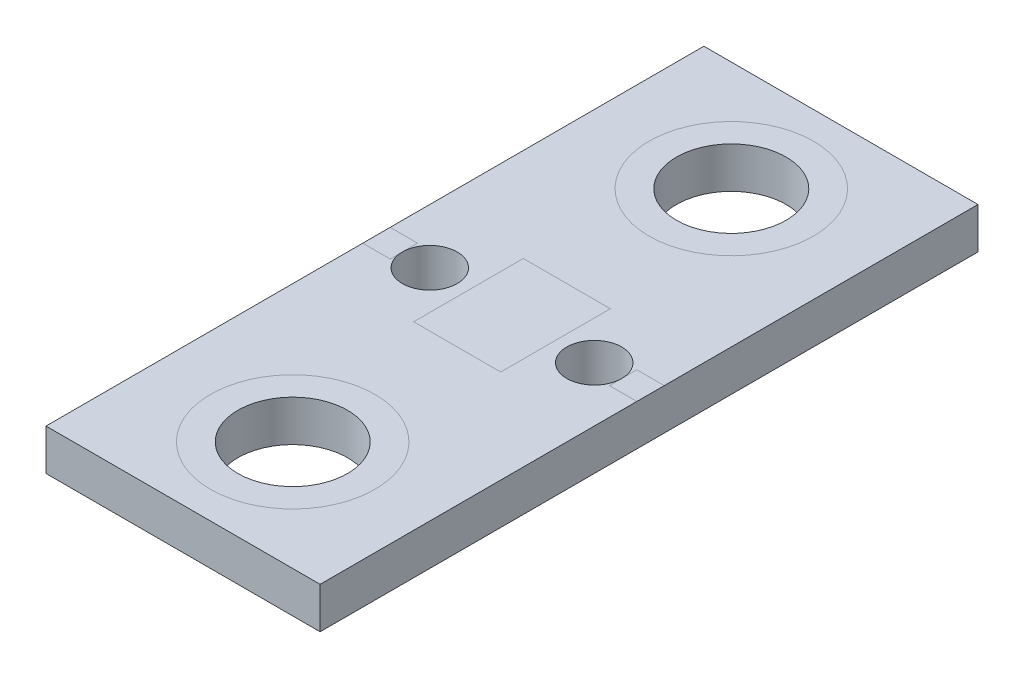
ISO-10303-21;
HEADER;
FILE_DESCRIPTION(('STEP AP214'),'2;1');
FILE_NAME('part.step','',(''),(''),'','','');
FILE_SCHEMA(('AUTOMOTIVE_DESIGN { 1 0 10303 214 1 1 1 1 }'));
ENDSEC;
DATA;
#1=APPLICATION_CONTEXT('core data for automotive mechanical design processes');
#2=APPLICATION_PROTOCOL_DEFINITION('international standard','automotive_design',2000,#1);
#3=PRODUCT_CONTEXT('',#1,'mechanical');
#4=PRODUCT('Part','Part','',(#3));
#5=PRODUCT_RELATED_PRODUCT_CATEGORY('part','',(#4));
#6=PRODUCT_DEFINITION_FORMATION('','',#4);
#7=PRODUCT_DEFINITION_CONTEXT('part definition',#1,'design');
#8=PRODUCT_DEFINITION('design','',#6,#7);
#9=PRODUCT_DEFINITION_SHAPE('','',#8);
#10=(LENGTH_UNIT() NAMED_UNIT(*) SI_UNIT(.MILLI.,.METRE.));
#11=(NAMED_UNIT(*) PLANE_ANGLE_UNIT() SI_UNIT($,.RADIAN.));
#12=(NAMED_UNIT(*) SI_UNIT($,.STERADIAN.) SOLID_ANGLE_UNIT());
#13=UNCERTAINTY_MEASURE_WITH_UNIT(LENGTH_MEASURE(1.E-05),#10,'distance_accuracy_value','');
#14=(GEOMETRIC_REPRESENTATION_CONTEXT(3) GLOBAL_UNCERTAINTY_ASSIGNED_CONTEXT((#13)) GLOBAL_UNIT_ASSIGNED_CONTEXT((#10,
#11,#12)) REPRESENTATION_CONTEXT('',''));
#15=CARTESIAN_POINT('',(0.,0.,0.));
#16=DIRECTION('',(0.,0.,1.));
#17=DIRECTION('',(1.,0.,0.));
#18=AXIS2_PLACEMENT_3D('',#15,#16,#17);
#19=CARTESIAN_POINT('',(0.,0.75,0.));
#20=DIRECTION('',(0.,1.,0.));
#21=DIRECTION('',(0.,0.,1.));
#22=AXIS2_PLACEMENT_3D('',#19,#20,#21);
#23=PLANE('',#22);
#24=CARTESIAN_POINT('',(0.,0.75,4.));
#25=DIRECTION('',(0.,1.,0.));
#26=DIRECTION('',(0.,0.,1.));
#27=AXIS2_PLACEMENT_3D('',#24,#25,#26);
#28=CIRCLE('',#27,1.5);
#29=CARTESIAN_POINT('',(0.,0.75,5.5));
#30=VERTEX_POINT('',#29);
#31=EDGE_CURVE('E50',#30,#30,#28,.F.);
#32=ORIENTED_EDGE('',*,*,#31,.T.);
#33=EDGE_LOOP('',(#32));
#34=FACE_BOUND('',#33,.T.);
#35=DIRECTION('',(0.,0.,-1.));
#36=VECTOR('',#35,1.);
#37=CARTESIAN_POINT('',(2.,0.75,0.));
#38=LINE('',#37,#36);
#39=CARTESIAN_POINT('',(2.,0.75,0.));
#40=VERTEX_POINT('',#39);
#41=CARTESIAN_POINT('',(2.,0.75,-0.277507708159874));
#42=VERTEX_POINT('',#41);
#43=EDGE_CURVE('E174',#40,#42,#38,.T.);
#44=ORIENTED_EDGE('',*,*,#43,.T.);
#45=DIRECTION('',(1.,0.,0.));
#46=VECTOR('',#45,1.);
#47=CARTESIAN_POINT('',(0.,0.75,-0.277507708159874));
#48=LINE('',#47,#46);
#49=CARTESIAN_POINT('',(2.5,0.75,-0.277507708159874));
#50=VERTEX_POINT('',#49);
#51=EDGE_CURVE('E129',#42,#50,#48,.T.);
#52=ORIENTED_EDGE('',*,*,#51,.T.);
#53=DIRECTION('',(0.,0.,-1.));
#54=VECTOR('',#53,1.);
#55=CARTESIAN_POINT('',(2.5,0.75,-6.));
#56=LINE('',#55,#54);
#57=CARTESIAN_POINT('',(2.5,0.75,-6.));
#58=VERTEX_POINT('',#57);
#59=EDGE_CURVE('E122',#50,#58,#56,.T.);
#60=ORIENTED_EDGE('',*,*,#59,.T.);
#61=DIRECTION('',(-1.,0.,0.));
#62=VECTOR('',#61,1.);
#63=CARTESIAN_POINT('',(-2.5,0.75,-6.));
#64=LINE('',#63,#62);
#65=CARTESIAN_POINT('',(-2.5,0.75,-6.));
#66=VERTEX_POINT('',#65);
#67=EDGE_CURVE('E127',#58,#66,#64,.T.);
#68=ORIENTED_EDGE('',*,*,#67,.T.);
#69=DIRECTION('',(0.,0.,1.));
#70=VECTOR('',#69,1.);
#71=CARTESIAN_POINT('',(-2.5,0.75,-6.));
#72=LINE('',#71,#70);
#73=CARTESIAN_POINT('',(-2.5,0.75,-0.277507708159873));
#74=VERTEX_POINT('',#73);
#75=EDGE_CURVE('E226',#66,#74,#72,.T.);
#76=ORIENTED_EDGE('',*,*,#75,.T.);
#77=DIRECTION('',(1.,0.,0.));
#78=VECTOR('',#77,1.);
#79=CARTESIAN_POINT('',(0.,0.75,-0.277507708159874));
#80=LINE('',#79,#78);
#81=CARTESIAN_POINT('',(-2.,0.75,-0.277507708159874));
#82=VERTEX_POINT('',#81);
#83=EDGE_CURVE('E163',#74,#82,#80,.T.);
#84=ORIENTED_EDGE('',*,*,#83,.T.);
#85=DIRECTION('',(0.,0.,1.));
#86=VECTOR('',#85,1.);
#87=CARTESIAN_POINT('',(-2.,0.75,0.));
#88=LINE('',#87,#86);
#89=CARTESIAN_POINT('',(-2.,0.75,0.));
#90=VERTEX_POINT('',#89);
#91=EDGE_CURVE('E162',#82,#90,#88,.T.);
#92=ORIENTED_EDGE('',*,*,#91,.T.);
#93=CARTESIAN_POINT('',(-1.5,0.75,0.));
#94=DIRECTION('',(0.,1.,0.));
#95=DIRECTION('',(0.,0.,1.));
#96=AXIS2_PLACEMENT_3D('',#93,#94,#95);
#97=CIRCLE('',#96,0.5);
#98=EDGE_CURVE('E220',#90,#90,#97,.T.);
#99=ORIENTED_EDGE('',*,*,#98,.F.);
#100=CARTESIAN_POINT('',(-2.,0.75,0.222492291840126));
#101=VERTEX_POINT('',#100);
#102=EDGE_CURVE('E154',#90,#101,#88,.T.);
#103=ORIENTED_EDGE('',*,*,#102,.T.);
#104=DIRECTION('',(-1.,0.,0.));
#105=VECTOR('',#104,1.);
#106=CARTESIAN_POINT('',(0.,0.75,0.222492291840126));
#107=LINE('',#106,#105);
#108=CARTESIAN_POINT('',(-2.5,0.75,0.222492291840126));
#109=VERTEX_POINT('',#108);
#110=EDGE_CURVE('E151',#101,#109,#107,.T.);
#111=ORIENTED_EDGE('',*,*,#110,.T.);
#112=CARTESIAN_POINT('',(-2.5,0.75,6.));
#113=VERTEX_POINT('',#112);
#114=EDGE_CURVE('E146',#109,#113,#72,.T.);
#115=ORIENTED_EDGE('',*,*,#114,.T.);
#116=DIRECTION('',(1.,0.,0.));
#117=VECTOR('',#116,1.);
#118=CARTESIAN_POINT('',(-2.5,0.75,6.));
#119=LINE('',#118,#117);
#120=CARTESIAN_POINT('',(2.5,0.75,6.));
#121=VERTEX_POINT('',#120);
#122=EDGE_CURVE('E228',#113,#121,#119,.T.);
#123=ORIENTED_EDGE('',*,*,#122,.T.);
#124=CARTESIAN_POINT('',(2.5,0.75,0.222492291840126));
#125=VERTEX_POINT('',#124);
#126=EDGE_CURVE('E137',#121,#125,#56,.T.);
#127=ORIENTED_EDGE('',*,*,#126,.T.);
#128=DIRECTION('',(-1.,0.,0.));
#129=VECTOR('',#128,1.);
#130=CARTESIAN_POINT('',(0.,0.75,0.222492291840126));
#131=LINE('',#130,#129);
#132=CARTESIAN_POINT('',(2.,0.75,0.222492291840126));
#133=VERTEX_POINT('',#132);
#134=EDGE_CURVE('E166',#125,#133,#131,.T.);
#135=ORIENTED_EDGE('',*,*,#134,.T.);
#136=EDGE_CURVE('E170',#133,#40,#38,.T.);
#137=ORIENTED_EDGE('',*,*,#136,.T.);
#138=CARTESIAN_POINT('',(1.5,0.75,0.));
#139=DIRECTION('',(0.,1.,0.));
#140=DIRECTION('',(0.,0.,1.));
#141=AXIS2_PLACEMENT_3D('',#138,#139,#140);
#142=CIRCLE('',#141,0.5);
#143=EDGE_CURVE('E208',#40,#40,#142,.T.);
#144=ORIENTED_EDGE('',*,*,#143,.F.);
#145=EDGE_LOOP('',(#44,#52,#60,#68,#76,#84,#92,#99,#103,#111,#115,#123,#127,#135,#137,#144));
#146=FACE_BOUND('',#145,.T.);
#147=DIRECTION('',(1.,0.,0.));
#148=VECTOR('',#147,1.);
#149=CARTESIAN_POINT('',(0.,0.75,-1.));
#150=LINE('',#149,#148);
#151=CARTESIAN_POINT('',(-0.79375,0.75,-1.));
#152=VERTEX_POINT('',#151);
#153=CARTESIAN_POINT('',(0.79375,0.75,-1.));
#154=VERTEX_POINT('',#153);
#155=EDGE_CURVE('E61',#152,#154,#150,.T.);
#156=ORIENTED_EDGE('',*,*,#155,.T.);
#157=DIRECTION('',(0.,0.,1.));
#158=VECTOR('',#157,1.);
#159=CARTESIAN_POINT('',(0.79375,0.75,0.));
#160=LINE('',#159,#158);
#161=CARTESIAN_POINT('',(0.79375,0.75,1.));
#162=VERTEX_POINT('',#161);
#163=EDGE_CURVE('E57',#154,#162,#160,.T.);
#164=ORIENTED_EDGE('',*,*,#163,.T.);
#165=DIRECTION('',(-1.,0.,0.));
#166=VECTOR('',#165,1.);
#167=CARTESIAN_POINT('',(0.,0.75,1.));
#168=LINE('',#167,#166);
#169=CARTESIAN_POINT('',(-0.79375,0.75,1.));
#170=VERTEX_POINT('',#169);
#171=EDGE_CURVE('E177',#162,#170,#168,.T.);
#172=ORIENTED_EDGE('',*,*,#171,.T.);
#173=DIRECTION('',(0.,0.,-1.));
#174=VECTOR('',#173,1.);
#175=CARTESIAN_POINT('',(-0.79375,0.75,0.));
#176=LINE('',#175,#174);
#177=EDGE_CURVE('E181',#170,#152,#176,.T.);
#178=ORIENTED_EDGE('',*,*,#177,.T.);
#179=EDGE_LOOP('',(#156,#164,#172,#178));
#180=FACE_BOUND('',#179,.T.);
#181=CARTESIAN_POINT('',(0.,0.75,-4.));
#182=DIRECTION('',(0.,1.,0.));
#183=DIRECTION('',(0.,0.,1.));
#184=AXIS2_PLACEMENT_3D('',#181,#182,#183);
#185=CIRCLE('',#184,1.5);
#186=CARTESIAN_POINT('',(0.,0.75,-2.5));
#187=VERTEX_POINT('',#186);
#188=EDGE_CURVE('E11',#187,#187,#185,.F.);
#189=ORIENTED_EDGE('',*,*,#188,.T.);
#190=EDGE_LOOP('',(#189));
#191=FACE_BOUND('',#190,.T.);
#192=ADVANCED_FACE('F41',(#34,#146,#180,#191),#23,.T.);
#193=ORIENTED_EDGE('',*,*,#188,.F.);
#194=EDGE_LOOP('',(#193));
#195=FACE_BOUND('',#194,.T.);
#196=CARTESIAN_POINT('',(0.,0.75,-4.));
#197=DIRECTION('',(0.,1.,0.));
#198=DIRECTION('',(0.,0.,1.));
#199=AXIS2_PLACEMENT_3D('',#196,#197,#198);
#200=CIRCLE('',#199,1.);
#201=CARTESIAN_POINT('',(0.,0.75,-3.));
#202=VERTEX_POINT('',#201);
#203=EDGE_CURVE('E211',#202,#202,#200,.T.);
#204=ORIENTED_EDGE('',*,*,#203,.F.);
#205=EDGE_LOOP('',(#204));
#206=FACE_BOUND('',#205,.T.);
#207=ADVANCED_FACE('F198',(#195,#206),#23,.T.);
#208=ORIENTED_EDGE('',*,*,#31,.F.);
#209=EDGE_LOOP('',(#208));
#210=FACE_BOUND('',#209,.T.);
#211=CARTESIAN_POINT('',(0.,0.75,4.));
#212=DIRECTION('',(0.,1.,0.));
#213=DIRECTION('',(0.,0.,1.));
#214=AXIS2_PLACEMENT_3D('',#211,#212,#213);
#215=CIRCLE('',#214,1.);
#216=CARTESIAN_POINT('',(0.,0.75,5.));
#217=VERTEX_POINT('',#216);
#218=EDGE_CURVE('E202',#217,#217,#215,.T.);
#219=ORIENTED_EDGE('',*,*,#218,.F.);
#220=EDGE_LOOP('',(#219));
#221=FACE_BOUND('',#220,.T.);
#222=ADVANCED_FACE('F194',(#210,#221),#23,.T.);
#223=ORIENTED_EDGE('',*,*,#163,.F.);
#224=ORIENTED_EDGE('',*,*,#155,.F.);
#225=ORIENTED_EDGE('',*,*,#177,.F.);
#226=ORIENTED_EDGE('',*,*,#171,.F.);
#227=EDGE_LOOP('',(#223,#224,#225,#226));
#228=FACE_BOUND('',#227,.T.);
#229=ADVANCED_FACE('F197',(#228),#23,.T.);
#230=ORIENTED_EDGE('',*,*,#51,.F.);
#231=ORIENTED_EDGE('',*,*,#43,.F.);
#232=ORIENTED_EDGE('',*,*,#136,.F.);
#233=ORIENTED_EDGE('',*,*,#134,.F.);
#234=EDGE_CURVE('E134',#125,#50,#56,.T.);
#235=ORIENTED_EDGE('',*,*,#234,.T.);
#236=EDGE_LOOP('',(#230,#231,#232,#233,#235));
#237=FACE_BOUND('',#236,.T.);
#238=ADVANCED_FACE('F290',(#237),#23,.T.);
#239=ORIENTED_EDGE('',*,*,#83,.F.);
#240=EDGE_CURVE('E229',#74,#109,#72,.T.);
#241=ORIENTED_EDGE('',*,*,#240,.T.);
#242=ORIENTED_EDGE('',*,*,#110,.F.);
#243=ORIENTED_EDGE('',*,*,#102,.F.);
#244=ORIENTED_EDGE('',*,*,#91,.F.);
#245=EDGE_LOOP('',(#239,#241,#242,#243,#244));
#246=FACE_BOUND('',#245,.T.);
#247=ADVANCED_FACE('F258',(#246),#23,.T.);
#248=CARTESIAN_POINT('',(0.,0.,0.));
#249=DIRECTION('',(0.,1.,0.));
#250=DIRECTION('',(0.,0.,1.));
#251=AXIS2_PLACEMENT_3D('',#248,#249,#250);
#252=PLANE('',#251);
#253=DIRECTION('',(0.,0.,-1.));
#254=VECTOR('',#253,1.);
#255=CARTESIAN_POINT('',(2.5,0.,-6.));
#256=LINE('',#255,#254);
#257=CARTESIAN_POINT('',(2.5,0.,6.));
#258=VERTEX_POINT('',#257);
#259=CARTESIAN_POINT('',(2.5,0.,-6.));
#260=VERTEX_POINT('',#259);
#261=EDGE_CURVE('E150',#258,#260,#256,.T.);
#262=ORIENTED_EDGE('',*,*,#261,.F.);
#263=DIRECTION('',(1.,0.,0.));
#264=VECTOR('',#263,1.);
#265=CARTESIAN_POINT('',(-2.5,0.,6.));
#266=LINE('',#265,#264);
#267=CARTESIAN_POINT('',(-2.5,0.,6.));
#268=VERTEX_POINT('',#267);
#269=EDGE_CURVE('E135',#268,#258,#266,.T.);
#270=ORIENTED_EDGE('',*,*,#269,.F.);
#271=DIRECTION('',(0.,0.,1.));
#272=VECTOR('',#271,1.);
#273=CARTESIAN_POINT('',(-2.5,0.,-6.));
#274=LINE('',#273,#272);
#275=CARTESIAN_POINT('',(-2.5,0.,-6.));
#276=VERTEX_POINT('',#275);
#277=EDGE_CURVE('E235',#276,#268,#274,.T.);
#278=ORIENTED_EDGE('',*,*,#277,.F.);
#279=DIRECTION('',(-1.,0.,0.));
#280=VECTOR('',#279,1.);
#281=CARTESIAN_POINT('',(-2.5,0.,-6.));
#282=LINE('',#281,#280);
#283=EDGE_CURVE('E233',#260,#276,#282,.T.);
#284=ORIENTED_EDGE('',*,*,#283,.F.);
#285=EDGE_LOOP('',(#262,#270,#278,#284));
#286=FACE_BOUND('',#285,.T.);
#287=CARTESIAN_POINT('',(-1.5,0.,0.));
#288=DIRECTION('',(0.,1.,0.));
#289=DIRECTION('',(0.,0.,1.));
#290=AXIS2_PLACEMENT_3D('',#287,#288,#289);
#291=CIRCLE('',#290,0.5);
#292=CARTESIAN_POINT('',(-1.5,0.,0.500000000000001));
#293=VERTEX_POINT('',#292);
#294=EDGE_CURVE('E218',#293,#293,#291,.T.);
#295=ORIENTED_EDGE('',*,*,#294,.T.);
#296=EDGE_LOOP('',(#295));
#297=FACE_BOUND('',#296,.T.);
#298=CARTESIAN_POINT('',(1.5,0.,0.));
#299=DIRECTION('',(0.,1.,0.));
#300=DIRECTION('',(0.,0.,1.));
#301=AXIS2_PLACEMENT_3D('',#298,#299,#300);
#302=CIRCLE('',#301,0.5);
#303=CARTESIAN_POINT('',(1.5,0.,0.5));
#304=VERTEX_POINT('',#303);
#305=EDGE_CURVE('E204',#304,#304,#302,.T.);
#306=ORIENTED_EDGE('',*,*,#305,.T.);
#307=EDGE_LOOP('',(#306));
#308=FACE_BOUND('',#307,.T.);
#309=CARTESIAN_POINT('',(0.,0.,4.));
#310=DIRECTION('',(0.,1.,0.));
#311=DIRECTION('',(0.,0.,1.));
#312=AXIS2_PLACEMENT_3D('',#309,#310,#311);
#313=CIRCLE('',#312,1.);
#314=CARTESIAN_POINT('',(0.,0.,5.));
#315=VERTEX_POINT('',#314);
#316=EDGE_CURVE('E205',#315,#315,#313,.T.);
#317=ORIENTED_EDGE('',*,*,#316,.T.);
#318=EDGE_LOOP('',(#317));
#319=FACE_BOUND('',#318,.T.);
#320=CARTESIAN_POINT('',(0.,0.,-4.));
#321=DIRECTION('',(0.,1.,0.));
#322=DIRECTION('',(0.,0.,1.));
#323=AXIS2_PLACEMENT_3D('',#320,#321,#322);
#324=CIRCLE('',#323,1.);
#325=CARTESIAN_POINT('',(0.,0.,-3.));
#326=VERTEX_POINT('',#325);
#327=EDGE_CURVE('E214',#326,#326,#324,.T.);
#328=ORIENTED_EDGE('',*,*,#327,.T.);
#329=EDGE_LOOP('',(#328));
#330=FACE_BOUND('',#329,.T.);
#331=ADVANCED_FACE('F249',(#286,#297,#308,#319,#330),#252,.F.);
#332=CARTESIAN_POINT('',(2.5,0.75,-6.));
#333=DIRECTION('',(-1.,0.,0.));
#334=DIRECTION('',(0.,0.,1.));
#335=AXIS2_PLACEMENT_3D('',#332,#333,#334);
#336=PLANE('',#335);
#337=ORIENTED_EDGE('',*,*,#261,.T.);
#338=DIRECTION('',(0.,-1.,0.));
#339=VECTOR('',#338,1.);
#340=CARTESIAN_POINT('',(2.5,0.75,-6.));
#341=LINE('',#340,#339);
#342=EDGE_CURVE('E141',#58,#260,#341,.T.);
#343=ORIENTED_EDGE('',*,*,#342,.F.);
#344=ORIENTED_EDGE('',*,*,#59,.F.);
#345=ORIENTED_EDGE('',*,*,#234,.F.);
#346=ORIENTED_EDGE('',*,*,#126,.F.);
#347=DIRECTION('',(0.,-1.,0.));
#348=VECTOR('',#347,1.);
#349=CARTESIAN_POINT('',(2.5,0.75,6.));
#350=LINE('',#349,#348);
#351=EDGE_CURVE('E231',#121,#258,#350,.T.);
#352=ORIENTED_EDGE('',*,*,#351,.T.);
#353=EDGE_LOOP('',(#337,#343,#344,#345,#346,#352));
#354=FACE_BOUND('',#353,.T.);
#355=ADVANCED_FACE('F43',(#354),#336,.F.);
#356=CARTESIAN_POINT('',(-2.5,0.75,-6.));
#357=DIRECTION('',(0.,0.,1.));
#358=DIRECTION('',(1.,0.,0.));
#359=AXIS2_PLACEMENT_3D('',#356,#357,#358);
#360=PLANE('',#359);
#361=ORIENTED_EDGE('',*,*,#283,.T.);
#362=DIRECTION('',(0.,-1.,0.));
#363=VECTOR('',#362,1.);
#364=CARTESIAN_POINT('',(-2.5,0.75,-6.));
#365=LINE('',#364,#363);
#366=EDGE_CURVE('E144',#66,#276,#365,.T.);
#367=ORIENTED_EDGE('',*,*,#366,.F.);
#368=ORIENTED_EDGE('',*,*,#67,.F.);
#369=ORIENTED_EDGE('',*,*,#342,.T.);
#370=EDGE_LOOP('',(#361,#367,#368,#369));
#371=FACE_BOUND('',#370,.T.);
#372=ADVANCED_FACE('F140',(#371),#360,.F.);
#373=CARTESIAN_POINT('',(-2.5,0.75,-6.));
#374=DIRECTION('',(1.,0.,0.));
#375=DIRECTION('',(0.,0.,-1.));
#376=AXIS2_PLACEMENT_3D('',#373,#374,#375);
#377=PLANE('',#376);
#378=ORIENTED_EDGE('',*,*,#277,.T.);
#379=DIRECTION('',(0.,-1.,0.));
#380=VECTOR('',#379,1.);
#381=CARTESIAN_POINT('',(-2.5,0.75,6.));
#382=LINE('',#381,#380);
#383=EDGE_CURVE('E156',#113,#268,#382,.T.);
#384=ORIENTED_EDGE('',*,*,#383,.F.);
#385=ORIENTED_EDGE('',*,*,#114,.F.);
#386=ORIENTED_EDGE('',*,*,#240,.F.);
#387=ORIENTED_EDGE('',*,*,#75,.F.);
#388=ORIENTED_EDGE('',*,*,#366,.T.);
#389=EDGE_LOOP('',(#378,#384,#385,#386,#387,#388));
#390=FACE_BOUND('',#389,.T.);
#391=ADVANCED_FACE('F251',(#390),#377,.F.);
#392=CARTESIAN_POINT('',(-2.5,0.75,6.));
#393=DIRECTION('',(0.,0.,-1.));
#394=DIRECTION('',(-1.,0.,0.));
#395=AXIS2_PLACEMENT_3D('',#392,#393,#394);
#396=PLANE('',#395);
#397=ORIENTED_EDGE('',*,*,#269,.T.);
#398=ORIENTED_EDGE('',*,*,#351,.F.);
#399=ORIENTED_EDGE('',*,*,#122,.F.);
#400=ORIENTED_EDGE('',*,*,#383,.T.);
#401=EDGE_LOOP('',(#397,#398,#399,#400));
#402=FACE_BOUND('',#401,.T.);
#403=ADVANCED_FACE('F243',(#402),#396,.F.);
#404=CARTESIAN_POINT('',(-1.5,0.75,0.));
#405=DIRECTION('',(0.,-1.,0.));
#406=DIRECTION('',(0.,0.,-1.));
#407=AXIS2_PLACEMENT_3D('',#404,#405,#406);
#408=CYLINDRICAL_SURFACE('',#407,0.5);
#409=ORIENTED_EDGE('',*,*,#98,.T.);
#410=EDGE_LOOP('',(#409));
#411=FACE_BOUND('',#410,.T.);
#412=ORIENTED_EDGE('',*,*,#294,.F.);
#413=EDGE_LOOP('',(#412));
#414=FACE_BOUND('',#413,.T.);
#415=ADVANCED_FACE('F296',(#411,#414),#408,.F.);
#416=CARTESIAN_POINT('',(1.5,0.75,0.));
#417=DIRECTION('',(0.,-1.,0.));
#418=DIRECTION('',(0.,0.,-1.));
#419=AXIS2_PLACEMENT_3D('',#416,#417,#418);
#420=CYLINDRICAL_SURFACE('',#419,0.5);
#421=ORIENTED_EDGE('',*,*,#143,.T.);
#422=EDGE_LOOP('',(#421));
#423=FACE_BOUND('',#422,.T.);
#424=ORIENTED_EDGE('',*,*,#305,.F.);
#425=EDGE_LOOP('',(#424));
#426=FACE_BOUND('',#425,.T.);
#427=ADVANCED_FACE('F292',(#423,#426),#420,.F.);
#428=CARTESIAN_POINT('',(0.,0.75,4.));
#429=DIRECTION('',(0.,-1.,0.));
#430=DIRECTION('',(0.,0.,-1.));
#431=AXIS2_PLACEMENT_3D('',#428,#429,#430);
#432=CYLINDRICAL_SURFACE('',#431,1.);
#433=ORIENTED_EDGE('',*,*,#218,.T.);
#434=EDGE_LOOP('',(#433));
#435=FACE_BOUND('',#434,.T.);
#436=ORIENTED_EDGE('',*,*,#316,.F.);
#437=EDGE_LOOP('',(#436));
#438=FACE_BOUND('',#437,.T.);
#439=ADVANCED_FACE('F295',(#435,#438),#432,.F.);
#440=CARTESIAN_POINT('',(0.,0.75,-4.));
#441=DIRECTION('',(0.,-1.,0.));
#442=DIRECTION('',(0.,0.,-1.));
#443=AXIS2_PLACEMENT_3D('',#440,#441,#442);
#444=CYLINDRICAL_SURFACE('',#443,1.);
#445=ORIENTED_EDGE('',*,*,#203,.T.);
#446=EDGE_LOOP('',(#445));
#447=FACE_BOUND('',#446,.T.);
#448=ORIENTED_EDGE('',*,*,#327,.F.);
#449=EDGE_LOOP('',(#448));
#450=FACE_BOUND('',#449,.T.);
#451=ADVANCED_FACE('F311',(#447,#450),#444,.F.);
#452=CLOSED_SHELL('',(#192,#207,#222,#229,#238,#247,#331,#355,#372,#391,#403,#415,#427,#439,#451));
#453=MANIFOLD_SOLID_BREP('B2',#452);
#454=ADVANCED_BREP_SHAPE_REPRESENTATION('',(#18,#453),#14);
#455=SHAPE_DEFINITION_REPRESENTATION(#9,#454);
ENDSEC;
END-ISO-10303-21;
